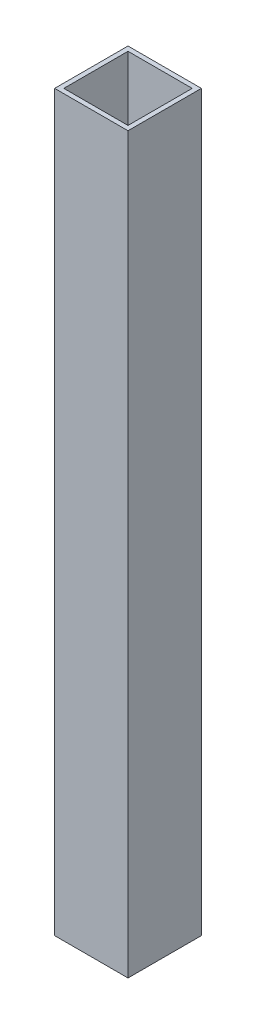
ISO-10303-21;
HEADER;
FILE_DESCRIPTION(('STEP AP214'),'2;1');
FILE_NAME('part.step','',(''),(''),'','','');
FILE_SCHEMA(('AUTOMOTIVE_DESIGN { 1 0 10303 214 1 1 1 1 }'));
ENDSEC;
DATA;
#1=APPLICATION_CONTEXT('core data for automotive mechanical design processes');
#2=APPLICATION_PROTOCOL_DEFINITION('international standard','automotive_design',2000,#1);
#3=PRODUCT_CONTEXT('',#1,'mechanical');
#4=PRODUCT('Part','Part','',(#3));
#5=PRODUCT_RELATED_PRODUCT_CATEGORY('part','',(#4));
#6=PRODUCT_DEFINITION_FORMATION('','',#4);
#7=PRODUCT_DEFINITION_CONTEXT('part definition',#1,'design');
#8=PRODUCT_DEFINITION('design','',#6,#7);
#9=PRODUCT_DEFINITION_SHAPE('','',#8);
#10=(LENGTH_UNIT() NAMED_UNIT(*) SI_UNIT(.MILLI.,.METRE.));
#11=(NAMED_UNIT(*) PLANE_ANGLE_UNIT() SI_UNIT($,.RADIAN.));
#12=(NAMED_UNIT(*) SI_UNIT($,.STERADIAN.) SOLID_ANGLE_UNIT());
#13=UNCERTAINTY_MEASURE_WITH_UNIT(LENGTH_MEASURE(1.E-05),#10,'distance_accuracy_value','');
#14=(GEOMETRIC_REPRESENTATION_CONTEXT(3) GLOBAL_UNCERTAINTY_ASSIGNED_CONTEXT((#13)) GLOBAL_UNIT_ASSIGNED_CONTEXT((#10,
#11,#12)) REPRESENTATION_CONTEXT('',''));
#15=CARTESIAN_POINT('',(0.,0.,0.));
#16=DIRECTION('',(0.,0.,1.));
#17=DIRECTION('',(1.,0.,0.));
#18=AXIS2_PLACEMENT_3D('',#15,#16,#17);
#19=CARTESIAN_POINT('',(0.,254.,0.));
#20=DIRECTION('',(0.,-1.,0.));
#21=DIRECTION('',(0.,0.,-1.));
#22=AXIS2_PLACEMENT_3D('',#19,#20,#21);
#23=PLANE('',#22);
#24=DIRECTION('',(0.,0.,1.));
#25=VECTOR('',#24,1.);
#26=CARTESIAN_POINT('',(-12.7,254.,-12.7));
#27=LINE('',#26,#25);
#28=CARTESIAN_POINT('',(-12.7,254.,-12.7));
#29=VERTEX_POINT('',#28);
#30=CARTESIAN_POINT('',(-12.7,254.,12.7));
#31=VERTEX_POINT('',#30);
#32=EDGE_CURVE('E136',#29,#31,#27,.T.);
#33=ORIENTED_EDGE('',*,*,#32,.T.);
#34=DIRECTION('',(1.,0.,0.));
#35=VECTOR('',#34,1.);
#36=CARTESIAN_POINT('',(12.7,254.,12.7));
#37=LINE('',#36,#35);
#38=CARTESIAN_POINT('',(12.7,254.,12.7));
#39=VERTEX_POINT('',#38);
#40=EDGE_CURVE('E139',#31,#39,#37,.T.);
#41=ORIENTED_EDGE('',*,*,#40,.T.);
#42=DIRECTION('',(0.,0.,-1.));
#43=VECTOR('',#42,1.);
#44=CARTESIAN_POINT('',(12.7,254.,-12.7));
#45=LINE('',#44,#43);
#46=CARTESIAN_POINT('',(12.7,254.,-12.7));
#47=VERTEX_POINT('',#46);
#48=EDGE_CURVE('E142',#39,#47,#45,.T.);
#49=ORIENTED_EDGE('',*,*,#48,.T.);
#50=DIRECTION('',(-1.,0.,0.));
#51=VECTOR('',#50,1.);
#52=CARTESIAN_POINT('',(12.7,254.,-12.7));
#53=LINE('',#52,#51);
#54=EDGE_CURVE('E144',#47,#29,#53,.T.);
#55=ORIENTED_EDGE('',*,*,#54,.T.);
#56=EDGE_LOOP('',(#33,#41,#49,#55));
#57=FACE_BOUND('',#56,.T.);
#58=DIRECTION('',(0.,0.,1.));
#59=VECTOR('',#58,1.);
#60=CARTESIAN_POINT('',(-11.1125,254.,-11.1125));
#61=LINE('',#60,#59);
#62=CARTESIAN_POINT('',(-11.1125,254.,-11.1125));
#63=VERTEX_POINT('',#62);
#64=CARTESIAN_POINT('',(-11.1125,254.,11.1125));
#65=VERTEX_POINT('',#64);
#66=EDGE_CURVE('E100',#63,#65,#61,.T.);
#67=ORIENTED_EDGE('',*,*,#66,.F.);
#68=DIRECTION('',(-1.,0.,0.));
#69=VECTOR('',#68,1.);
#70=CARTESIAN_POINT('',(11.1125,254.,-11.1125));
#71=LINE('',#70,#69);
#72=CARTESIAN_POINT('',(11.1125,254.,-11.1125));
#73=VERTEX_POINT('',#72);
#74=EDGE_CURVE('E122',#73,#63,#71,.T.);
#75=ORIENTED_EDGE('',*,*,#74,.F.);
#76=DIRECTION('',(0.,0.,-1.));
#77=VECTOR('',#76,1.);
#78=CARTESIAN_POINT('',(11.1125,254.,-11.1125));
#79=LINE('',#78,#77);
#80=CARTESIAN_POINT('',(11.1125,254.,11.1125));
#81=VERTEX_POINT('',#80);
#82=EDGE_CURVE('E120',#81,#73,#79,.T.);
#83=ORIENTED_EDGE('',*,*,#82,.F.);
#84=DIRECTION('',(1.,0.,0.));
#85=VECTOR('',#84,1.);
#86=CARTESIAN_POINT('',(11.1125,254.,11.1125));
#87=LINE('',#86,#85);
#88=EDGE_CURVE('E108',#65,#81,#87,.T.);
#89=ORIENTED_EDGE('',*,*,#88,.F.);
#90=EDGE_LOOP('',(#67,#75,#83,#89));
#91=FACE_BOUND('',#90,.T.);
#92=ADVANCED_FACE('F35',(#57,#91),#23,.F.);
#93=CARTESIAN_POINT('',(0.,0.,0.));
#94=DIRECTION('',(0.,-1.,0.));
#95=DIRECTION('',(0.,0.,-1.));
#96=AXIS2_PLACEMENT_3D('',#93,#94,#95);
#97=PLANE('',#96);
#98=DIRECTION('',(0.,0.,1.));
#99=VECTOR('',#98,1.);
#100=CARTESIAN_POINT('',(-12.7,0.,-12.7));
#101=LINE('',#100,#99);
#102=CARTESIAN_POINT('',(-12.7,0.,-12.7));
#103=VERTEX_POINT('',#102);
#104=CARTESIAN_POINT('',(-12.7,0.,12.7));
#105=VERTEX_POINT('',#104);
#106=EDGE_CURVE('E116',#103,#105,#101,.T.);
#107=ORIENTED_EDGE('',*,*,#106,.F.);
#108=DIRECTION('',(-1.,0.,0.));
#109=VECTOR('',#108,1.);
#110=CARTESIAN_POINT('',(12.7,0.,-12.7));
#111=LINE('',#110,#109);
#112=CARTESIAN_POINT('',(12.7,0.,-12.7));
#113=VERTEX_POINT('',#112);
#114=EDGE_CURVE('E140',#113,#103,#111,.T.);
#115=ORIENTED_EDGE('',*,*,#114,.F.);
#116=DIRECTION('',(0.,0.,-1.));
#117=VECTOR('',#116,1.);
#118=CARTESIAN_POINT('',(12.7,0.,-12.7));
#119=LINE('',#118,#117);
#120=CARTESIAN_POINT('',(12.7,0.,12.7));
#121=VERTEX_POINT('',#120);
#122=EDGE_CURVE('E151',#121,#113,#119,.T.);
#123=ORIENTED_EDGE('',*,*,#122,.F.);
#124=DIRECTION('',(1.,0.,0.));
#125=VECTOR('',#124,1.);
#126=CARTESIAN_POINT('',(12.7,0.,12.7));
#127=LINE('',#126,#125);
#128=EDGE_CURVE('E149',#105,#121,#127,.T.);
#129=ORIENTED_EDGE('',*,*,#128,.F.);
#130=EDGE_LOOP('',(#107,#115,#123,#129));
#131=FACE_BOUND('',#130,.T.);
#132=DIRECTION('',(-1.,0.,0.));
#133=VECTOR('',#132,1.);
#134=CARTESIAN_POINT('',(11.1125,0.,-11.1125));
#135=LINE('',#134,#133);
#136=CARTESIAN_POINT('',(11.1125,0.,-11.1125));
#137=VERTEX_POINT('',#136);
#138=CARTESIAN_POINT('',(-11.1125,0.,-11.1125));
#139=VERTEX_POINT('',#138);
#140=EDGE_CURVE('E109',#137,#139,#135,.T.);
#141=ORIENTED_EDGE('',*,*,#140,.T.);
#142=DIRECTION('',(0.,0.,1.));
#143=VECTOR('',#142,1.);
#144=CARTESIAN_POINT('',(-11.1125,0.,-11.1125));
#145=LINE('',#144,#143);
#146=CARTESIAN_POINT('',(-11.1125,0.,11.1125));
#147=VERTEX_POINT('',#146);
#148=EDGE_CURVE('E58',#139,#147,#145,.T.);
#149=ORIENTED_EDGE('',*,*,#148,.T.);
#150=DIRECTION('',(1.,0.,0.));
#151=VECTOR('',#150,1.);
#152=CARTESIAN_POINT('',(11.1125,0.,11.1125));
#153=LINE('',#152,#151);
#154=CARTESIAN_POINT('',(11.1125,0.,11.1125));
#155=VERTEX_POINT('',#154);
#156=EDGE_CURVE('E115',#147,#155,#153,.T.);
#157=ORIENTED_EDGE('',*,*,#156,.T.);
#158=DIRECTION('',(0.,0.,-1.));
#159=VECTOR('',#158,1.);
#160=CARTESIAN_POINT('',(11.1125,0.,-11.1125));
#161=LINE('',#160,#159);
#162=EDGE_CURVE('E128',#155,#137,#161,.T.);
#163=ORIENTED_EDGE('',*,*,#162,.T.);
#164=EDGE_LOOP('',(#141,#149,#157,#163));
#165=FACE_BOUND('',#164,.T.);
#166=ADVANCED_FACE('F169',(#131,#165),#97,.T.);
#167=CARTESIAN_POINT('',(-12.7,254.,-12.7));
#168=DIRECTION('',(1.,0.,0.));
#169=DIRECTION('',(0.,0.,-1.));
#170=AXIS2_PLACEMENT_3D('',#167,#168,#169);
#171=PLANE('',#170);
#172=ORIENTED_EDGE('',*,*,#106,.T.);
#173=DIRECTION('',(0.,-1.,0.));
#174=VECTOR('',#173,1.);
#175=CARTESIAN_POINT('',(-12.7,254.,12.7));
#176=LINE('',#175,#174);
#177=EDGE_CURVE('E11',#31,#105,#176,.T.);
#178=ORIENTED_EDGE('',*,*,#177,.F.);
#179=ORIENTED_EDGE('',*,*,#32,.F.);
#180=DIRECTION('',(0.,-1.,0.));
#181=VECTOR('',#180,1.);
#182=CARTESIAN_POINT('',(-12.7,254.,-12.7));
#183=LINE('',#182,#181);
#184=EDGE_CURVE('E146',#29,#103,#183,.T.);
#185=ORIENTED_EDGE('',*,*,#184,.T.);
#186=EDGE_LOOP('',(#172,#178,#179,#185));
#187=FACE_BOUND('',#186,.T.);
#188=ADVANCED_FACE('F37',(#187),#171,.F.);
#189=CARTESIAN_POINT('',(12.7,254.,12.7));
#190=DIRECTION('',(0.,0.,-1.));
#191=DIRECTION('',(-1.,0.,0.));
#192=AXIS2_PLACEMENT_3D('',#189,#190,#191);
#193=PLANE('',#192);
#194=ORIENTED_EDGE('',*,*,#128,.T.);
#195=DIRECTION('',(0.,-1.,0.));
#196=VECTOR('',#195,1.);
#197=CARTESIAN_POINT('',(12.7,254.,12.7));
#198=LINE('',#197,#196);
#199=EDGE_CURVE('E43',#39,#121,#198,.T.);
#200=ORIENTED_EDGE('',*,*,#199,.F.);
#201=ORIENTED_EDGE('',*,*,#40,.F.);
#202=ORIENTED_EDGE('',*,*,#177,.T.);
#203=EDGE_LOOP('',(#194,#200,#201,#202));
#204=FACE_BOUND('',#203,.T.);
#205=ADVANCED_FACE('F179',(#204),#193,.F.);
#206=CARTESIAN_POINT('',(12.7,254.,-12.7));
#207=DIRECTION('',(-1.,0.,0.));
#208=DIRECTION('',(0.,0.,1.));
#209=AXIS2_PLACEMENT_3D('',#206,#207,#208);
#210=PLANE('',#209);
#211=ORIENTED_EDGE('',*,*,#122,.T.);
#212=DIRECTION('',(0.,-1.,0.));
#213=VECTOR('',#212,1.);
#214=CARTESIAN_POINT('',(12.7,254.,-12.7));
#215=LINE('',#214,#213);
#216=EDGE_CURVE('E156',#47,#113,#215,.T.);
#217=ORIENTED_EDGE('',*,*,#216,.F.);
#218=ORIENTED_EDGE('',*,*,#48,.F.);
#219=ORIENTED_EDGE('',*,*,#199,.T.);
#220=EDGE_LOOP('',(#211,#217,#218,#219));
#221=FACE_BOUND('',#220,.T.);
#222=ADVANCED_FACE('F163',(#221),#210,.F.);
#223=CARTESIAN_POINT('',(12.7,254.,-12.7));
#224=DIRECTION('',(0.,0.,1.));
#225=DIRECTION('',(1.,0.,0.));
#226=AXIS2_PLACEMENT_3D('',#223,#224,#225);
#227=PLANE('',#226);
#228=ORIENTED_EDGE('',*,*,#114,.T.);
#229=ORIENTED_EDGE('',*,*,#184,.F.);
#230=ORIENTED_EDGE('',*,*,#54,.F.);
#231=ORIENTED_EDGE('',*,*,#216,.T.);
#232=EDGE_LOOP('',(#228,#229,#230,#231));
#233=FACE_BOUND('',#232,.T.);
#234=ADVANCED_FACE('F173',(#233),#227,.F.);
#235=CARTESIAN_POINT('',(-11.1125,254.,-11.1125));
#236=DIRECTION('',(1.,0.,0.));
#237=DIRECTION('',(0.,0.,-1.));
#238=AXIS2_PLACEMENT_3D('',#235,#236,#237);
#239=PLANE('',#238);
#240=ORIENTED_EDGE('',*,*,#148,.F.);
#241=DIRECTION('',(0.,-1.,0.));
#242=VECTOR('',#241,1.);
#243=CARTESIAN_POINT('',(-11.1125,254.,-11.1125));
#244=LINE('',#243,#242);
#245=EDGE_CURVE('E104',#63,#139,#244,.T.);
#246=ORIENTED_EDGE('',*,*,#245,.F.);
#247=ORIENTED_EDGE('',*,*,#66,.T.);
#248=DIRECTION('',(0.,-1.,0.));
#249=VECTOR('',#248,1.);
#250=CARTESIAN_POINT('',(-11.1125,254.,11.1125));
#251=LINE('',#250,#249);
#252=EDGE_CURVE('E103',#65,#147,#251,.T.);
#253=ORIENTED_EDGE('',*,*,#252,.T.);
#254=EDGE_LOOP('',(#240,#246,#247,#253));
#255=FACE_BOUND('',#254,.T.);
#256=ADVANCED_FACE('F102',(#255),#239,.T.);
#257=CARTESIAN_POINT('',(11.1125,254.,11.1125));
#258=DIRECTION('',(0.,0.,-1.));
#259=DIRECTION('',(-1.,0.,0.));
#260=AXIS2_PLACEMENT_3D('',#257,#258,#259);
#261=PLANE('',#260);
#262=ORIENTED_EDGE('',*,*,#156,.F.);
#263=ORIENTED_EDGE('',*,*,#252,.F.);
#264=ORIENTED_EDGE('',*,*,#88,.T.);
#265=DIRECTION('',(0.,-1.,0.));
#266=VECTOR('',#265,1.);
#267=CARTESIAN_POINT('',(11.1125,254.,11.1125));
#268=LINE('',#267,#266);
#269=EDGE_CURVE('E117',#81,#155,#268,.T.);
#270=ORIENTED_EDGE('',*,*,#269,.T.);
#271=EDGE_LOOP('',(#262,#263,#264,#270));
#272=FACE_BOUND('',#271,.T.);
#273=ADVANCED_FACE('F112',(#272),#261,.T.);
#274=CARTESIAN_POINT('',(11.1125,254.,-11.1125));
#275=DIRECTION('',(-1.,0.,0.));
#276=DIRECTION('',(0.,0.,1.));
#277=AXIS2_PLACEMENT_3D('',#274,#275,#276);
#278=PLANE('',#277);
#279=ORIENTED_EDGE('',*,*,#162,.F.);
#280=ORIENTED_EDGE('',*,*,#269,.F.);
#281=ORIENTED_EDGE('',*,*,#82,.T.);
#282=DIRECTION('',(0.,-1.,0.));
#283=VECTOR('',#282,1.);
#284=CARTESIAN_POINT('',(11.1125,254.,-11.1125));
#285=LINE('',#284,#283);
#286=EDGE_CURVE('E50',#73,#137,#285,.T.);
#287=ORIENTED_EDGE('',*,*,#286,.T.);
#288=EDGE_LOOP('',(#279,#280,#281,#287));
#289=FACE_BOUND('',#288,.T.);
#290=ADVANCED_FACE('F202',(#289),#278,.T.);
#291=CARTESIAN_POINT('',(11.1125,254.,-11.1125));
#292=DIRECTION('',(0.,0.,1.));
#293=DIRECTION('',(1.,0.,0.));
#294=AXIS2_PLACEMENT_3D('',#291,#292,#293);
#295=PLANE('',#294);
#296=ORIENTED_EDGE('',*,*,#140,.F.);
#297=ORIENTED_EDGE('',*,*,#286,.F.);
#298=ORIENTED_EDGE('',*,*,#74,.T.);
#299=ORIENTED_EDGE('',*,*,#245,.T.);
#300=EDGE_LOOP('',(#296,#297,#298,#299));
#301=FACE_BOUND('',#300,.T.);
#302=ADVANCED_FACE('F206',(#301),#295,.T.);
#303=CLOSED_SHELL('',(#92,#166,#188,#205,#222,#234,#256,#273,#290,#302));
#304=MANIFOLD_SOLID_BREP('B2',#303);
#305=ADVANCED_BREP_SHAPE_REPRESENTATION('',(#18,#304),#14);
#306=SHAPE_DEFINITION_REPRESENTATION(#9,#305);
ENDSEC;
END-ISO-10303-21;
